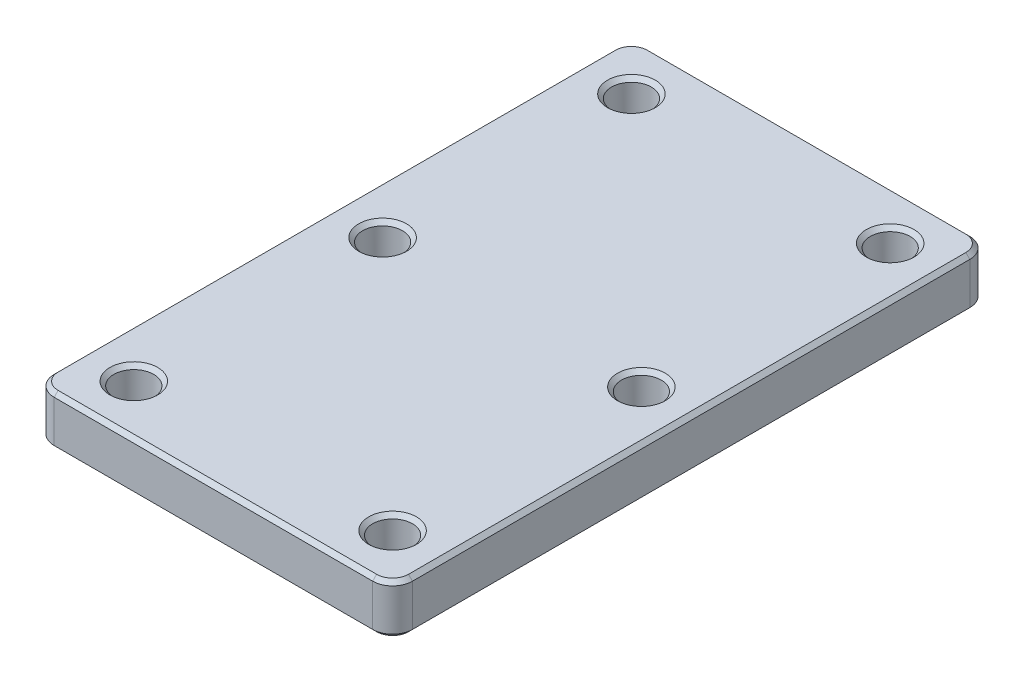
ISO-10303-21;
HEADER;
FILE_DESCRIPTION(('STEP AP214'),'2;1');
FILE_NAME('part.step','',(''),(''),'','','');
FILE_SCHEMA(('AUTOMOTIVE_DESIGN { 1 0 10303 214 1 1 1 1 }'));
ENDSEC;
DATA;
#1=APPLICATION_CONTEXT('core data for automotive mechanical design processes');
#2=APPLICATION_PROTOCOL_DEFINITION('international standard','automotive_design',2000,#1);
#3=PRODUCT_CONTEXT('',#1,'mechanical');
#4=PRODUCT('Part','Part','',(#3));
#5=PRODUCT_RELATED_PRODUCT_CATEGORY('part','',(#4));
#6=PRODUCT_DEFINITION_FORMATION('','',#4);
#7=PRODUCT_DEFINITION_CONTEXT('part definition',#1,'design');
#8=PRODUCT_DEFINITION('design','',#6,#7);
#9=PRODUCT_DEFINITION_SHAPE('','',#8);
#10=(LENGTH_UNIT() NAMED_UNIT(*) SI_UNIT(.MILLI.,.METRE.));
#11=(NAMED_UNIT(*) PLANE_ANGLE_UNIT() SI_UNIT($,.RADIAN.));
#12=(NAMED_UNIT(*) SI_UNIT($,.STERADIAN.) SOLID_ANGLE_UNIT());
#13=UNCERTAINTY_MEASURE_WITH_UNIT(LENGTH_MEASURE(1.E-05),#10,'distance_accuracy_value','');
#14=(GEOMETRIC_REPRESENTATION_CONTEXT(3) GLOBAL_UNCERTAINTY_ASSIGNED_CONTEXT((#13)) GLOBAL_UNIT_ASSIGNED_CONTEXT((#10,
#11,#12)) REPRESENTATION_CONTEXT('',''));
#15=CARTESIAN_POINT('',(0.,0.,0.));
#16=DIRECTION('',(0.,0.,1.));
#17=DIRECTION('',(1.,0.,0.));
#18=AXIS2_PLACEMENT_3D('',#15,#16,#17);
#19=CARTESIAN_POINT('',(0.,25.,0.));
#20=DIRECTION('',(0.,-1.,0.));
#21=DIRECTION('',(0.,0.,-1.));
#22=AXIS2_PLACEMENT_3D('',#19,#20,#21);
#23=PLANE('',#22);
#24=CARTESIAN_POINT('',(24.9999999999999,25.,-25.));
#25=DIRECTION('',(0.,-1.,0.));
#26=DIRECTION('',(0.,0.,-1.));
#27=AXIS2_PLACEMENT_3D('',#24,#25,#26);
#28=CIRCLE('',#27,12.);
#29=CARTESIAN_POINT('',(24.9999999999999,25.,-37.0000000000001));
#30=VERTEX_POINT('',#29);
#31=EDGE_CURVE('E364',#30,#30,#28,.T.);
#32=ORIENTED_EDGE('',*,*,#31,.T.);
#33=EDGE_LOOP('',(#32));
#34=FACE_BOUND('',#33,.T.);
#35=CARTESIAN_POINT('',(25.,25.,-150.));
#36=DIRECTION('',(0.,-1.,0.));
#37=DIRECTION('',(0.,0.,-1.));
#38=AXIS2_PLACEMENT_3D('',#35,#36,#37);
#39=CIRCLE('',#38,12.);
#40=CARTESIAN_POINT('',(25.,25.,-162.));
#41=VERTEX_POINT('',#40);
#42=EDGE_CURVE('E360',#41,#41,#39,.T.);
#43=ORIENTED_EDGE('',*,*,#42,.T.);
#44=EDGE_LOOP('',(#43));
#45=FACE_BOUND('',#44,.T.);
#46=CARTESIAN_POINT('',(25.,25.,-275.));
#47=DIRECTION('',(0.,-1.,0.));
#48=DIRECTION('',(0.,0.,-1.));
#49=AXIS2_PLACEMENT_3D('',#46,#47,#48);
#50=CIRCLE('',#49,12.0000000000001);
#51=CARTESIAN_POINT('',(25.,25.,-287.));
#52=VERTEX_POINT('',#51);
#53=EDGE_CURVE('E356',#52,#52,#50,.T.);
#54=ORIENTED_EDGE('',*,*,#53,.T.);
#55=EDGE_LOOP('',(#54));
#56=FACE_BOUND('',#55,.T.);
#57=CARTESIAN_POINT('',(155.,25.,-275.));
#58=DIRECTION('',(0.,-1.,0.));
#59=DIRECTION('',(0.,0.,-1.));
#60=AXIS2_PLACEMENT_3D('',#57,#58,#59);
#61=CIRCLE('',#60,12.);
#62=CARTESIAN_POINT('',(155.,25.,-287.));
#63=VERTEX_POINT('',#62);
#64=EDGE_CURVE('E352',#63,#63,#61,.T.);
#65=ORIENTED_EDGE('',*,*,#64,.T.);
#66=EDGE_LOOP('',(#65));
#67=FACE_BOUND('',#66,.T.);
#68=CARTESIAN_POINT('',(155.,25.,-150.));
#69=DIRECTION('',(0.,-1.,0.));
#70=DIRECTION('',(0.,0.,-1.));
#71=AXIS2_PLACEMENT_3D('',#68,#69,#70);
#72=CIRCLE('',#71,12.);
#73=CARTESIAN_POINT('',(155.,25.,-162.));
#74=VERTEX_POINT('',#73);
#75=EDGE_CURVE('E348',#74,#74,#72,.T.);
#76=ORIENTED_EDGE('',*,*,#75,.T.);
#77=EDGE_LOOP('',(#76));
#78=FACE_BOUND('',#77,.T.);
#79=CARTESIAN_POINT('',(155.,25.,-25.));
#80=DIRECTION('',(0.,-1.,0.));
#81=DIRECTION('',(0.,0.,-1.));
#82=AXIS2_PLACEMENT_3D('',#79,#80,#81);
#83=CIRCLE('',#82,12.);
#84=CARTESIAN_POINT('',(155.,25.,-37.));
#85=VERTEX_POINT('',#84);
#86=EDGE_CURVE('E290',#85,#85,#83,.T.);
#87=ORIENTED_EDGE('',*,*,#86,.T.);
#88=EDGE_LOOP('',(#87));
#89=FACE_BOUND('',#88,.T.);
#90=CARTESIAN_POINT('',(10.,25.,-10.));
#91=DIRECTION('',(0.,-1.,0.));
#92=DIRECTION('',(0.,0.,-1.));
#93=AXIS2_PLACEMENT_3D('',#90,#91,#92);
#94=CIRCLE('',#93,8.00000000000005);
#95=CARTESIAN_POINT('',(1.99999999999995,25.,-10.));
#96=VERTEX_POINT('',#95);
#97=CARTESIAN_POINT('',(10.,25.,-1.99999999999995));
#98=VERTEX_POINT('',#97);
#99=EDGE_CURVE('E70',#96,#98,#94,.F.);
#100=ORIENTED_EDGE('',*,*,#99,.T.);
#101=DIRECTION('',(1.,0.,0.));
#102=VECTOR('',#101,1.);
#103=CARTESIAN_POINT('',(0.,25.,-1.99999999999994));
#104=LINE('',#103,#102);
#105=CARTESIAN_POINT('',(170.,25.,-1.99999999999994));
#106=VERTEX_POINT('',#105);
#107=EDGE_CURVE('E165',#98,#106,#104,.T.);
#108=ORIENTED_EDGE('',*,*,#107,.T.);
#109=CARTESIAN_POINT('',(170.,25.,-10.));
#110=DIRECTION('',(0.,-1.,0.));
#111=DIRECTION('',(0.,0.,-1.));
#112=AXIS2_PLACEMENT_3D('',#109,#110,#111);
#113=CIRCLE('',#112,8.00000000000006);
#114=CARTESIAN_POINT('',(178.,25.,-10.));
#115=VERTEX_POINT('',#114);
#116=EDGE_CURVE('E285',#106,#115,#113,.F.);
#117=ORIENTED_EDGE('',*,*,#116,.T.);
#118=DIRECTION('',(0.,0.,-1.));
#119=VECTOR('',#118,1.);
#120=CARTESIAN_POINT('',(178.,25.,0.));
#121=LINE('',#120,#119);
#122=CARTESIAN_POINT('',(178.,25.,-290.));
#123=VERTEX_POINT('',#122);
#124=EDGE_CURVE('E280',#115,#123,#121,.T.);
#125=ORIENTED_EDGE('',*,*,#124,.T.);
#126=CARTESIAN_POINT('',(170.,25.,-290.));
#127=DIRECTION('',(0.,-1.,0.));
#128=DIRECTION('',(0.,0.,-1.));
#129=AXIS2_PLACEMENT_3D('',#126,#127,#128);
#130=CIRCLE('',#129,8.00000000000006);
#131=CARTESIAN_POINT('',(170.,25.,-298.));
#132=VERTEX_POINT('',#131);
#133=EDGE_CURVE('E274',#123,#132,#130,.F.);
#134=ORIENTED_EDGE('',*,*,#133,.T.);
#135=DIRECTION('',(-1.,0.,0.));
#136=VECTOR('',#135,1.);
#137=CARTESIAN_POINT('',(0.,25.,-298.));
#138=LINE('',#137,#136);
#139=CARTESIAN_POINT('',(10.,25.,-298.));
#140=VERTEX_POINT('',#139);
#141=EDGE_CURVE('E268',#132,#140,#138,.T.);
#142=ORIENTED_EDGE('',*,*,#141,.T.);
#143=CARTESIAN_POINT('',(10.,25.,-290.));
#144=DIRECTION('',(0.,-1.,0.));
#145=DIRECTION('',(0.,0.,-1.));
#146=AXIS2_PLACEMENT_3D('',#143,#144,#145);
#147=CIRCLE('',#146,8.00000000000005);
#148=CARTESIAN_POINT('',(1.99999999999995,25.,-290.));
#149=VERTEX_POINT('',#148);
#150=EDGE_CURVE('E271',#140,#149,#147,.F.);
#151=ORIENTED_EDGE('',*,*,#150,.T.);
#152=DIRECTION('',(0.,0.,1.));
#153=VECTOR('',#152,1.);
#154=CARTESIAN_POINT('',(1.99999999999995,25.,0.));
#155=LINE('',#154,#153);
#156=EDGE_CURVE('E277',#149,#96,#155,.T.);
#157=ORIENTED_EDGE('',*,*,#156,.T.);
#158=EDGE_LOOP('',(#100,#108,#117,#125,#134,#142,#151,#157));
#159=FACE_BOUND('',#158,.T.);
#160=ADVANCED_FACE('F45',(#34,#45,#56,#67,#78,#89,#159),#23,.F.);
#161=CARTESIAN_POINT('',(0.,0.,0.));
#162=DIRECTION('',(0.,-1.,0.));
#163=DIRECTION('',(0.,0.,-1.));
#164=AXIS2_PLACEMENT_3D('',#161,#162,#163);
#165=PLANE('',#164);
#166=CARTESIAN_POINT('',(170.,0.,-10.));
#167=DIRECTION('',(0.,-1.,0.));
#168=DIRECTION('',(0.,0.,-1.));
#169=AXIS2_PLACEMENT_3D('',#166,#167,#168);
#170=CIRCLE('',#169,8.00000000000006);
#171=CARTESIAN_POINT('',(178.,0.,-10.));
#172=VERTEX_POINT('',#171);
#173=CARTESIAN_POINT('',(170.,0.,-1.99999999999994));
#174=VERTEX_POINT('',#173);
#175=EDGE_CURVE('E224',#172,#174,#170,.T.);
#176=ORIENTED_EDGE('',*,*,#175,.T.);
#177=DIRECTION('',(-1.,0.,0.));
#178=VECTOR('',#177,1.);
#179=CARTESIAN_POINT('',(10.,0.,-1.99999999999994));
#180=LINE('',#179,#178);
#181=CARTESIAN_POINT('',(10.,0.,-1.99999999999994));
#182=VERTEX_POINT('',#181);
#183=EDGE_CURVE('E227',#174,#182,#180,.T.);
#184=ORIENTED_EDGE('',*,*,#183,.T.);
#185=CARTESIAN_POINT('',(10.,0.,-10.));
#186=DIRECTION('',(0.,-1.,0.));
#187=DIRECTION('',(0.,0.,-1.));
#188=AXIS2_PLACEMENT_3D('',#185,#186,#187);
#189=CIRCLE('',#188,8.00000000000005);
#190=CARTESIAN_POINT('',(1.99999999999995,0.,-10.));
#191=VERTEX_POINT('',#190);
#192=EDGE_CURVE('E221',#182,#191,#189,.T.);
#193=ORIENTED_EDGE('',*,*,#192,.T.);
#194=DIRECTION('',(0.,0.,-1.));
#195=VECTOR('',#194,1.);
#196=CARTESIAN_POINT('',(1.99999999999995,0.,-290.));
#197=LINE('',#196,#195);
#198=CARTESIAN_POINT('',(1.99999999999994,0.,-290.));
#199=VERTEX_POINT('',#198);
#200=EDGE_CURVE('E215',#191,#199,#197,.T.);
#201=ORIENTED_EDGE('',*,*,#200,.T.);
#202=CARTESIAN_POINT('',(10.,0.,-290.));
#203=DIRECTION('',(0.,-1.,0.));
#204=DIRECTION('',(0.,0.,-1.));
#205=AXIS2_PLACEMENT_3D('',#202,#203,#204);
#206=CIRCLE('',#205,8.00000000000006);
#207=CARTESIAN_POINT('',(10.,0.,-298.));
#208=VERTEX_POINT('',#207);
#209=EDGE_CURVE('E209',#199,#208,#206,.T.);
#210=ORIENTED_EDGE('',*,*,#209,.T.);
#211=DIRECTION('',(1.,0.,0.));
#212=VECTOR('',#211,1.);
#213=CARTESIAN_POINT('',(170.,0.,-298.));
#214=LINE('',#213,#212);
#215=CARTESIAN_POINT('',(170.,0.,-298.));
#216=VERTEX_POINT('',#215);
#217=EDGE_CURVE('E206',#208,#216,#214,.T.);
#218=ORIENTED_EDGE('',*,*,#217,.T.);
#219=CARTESIAN_POINT('',(170.,0.,-290.));
#220=DIRECTION('',(0.,-1.,0.));
#221=DIRECTION('',(0.,0.,-1.));
#222=AXIS2_PLACEMENT_3D('',#219,#220,#221);
#223=CIRCLE('',#222,8.00000000000006);
#224=CARTESIAN_POINT('',(178.,0.,-290.));
#225=VERTEX_POINT('',#224);
#226=EDGE_CURVE('E212',#216,#225,#223,.T.);
#227=ORIENTED_EDGE('',*,*,#226,.T.);
#228=DIRECTION('',(0.,0.,1.));
#229=VECTOR('',#228,1.);
#230=CARTESIAN_POINT('',(178.,0.,-10.));
#231=LINE('',#230,#229);
#232=EDGE_CURVE('E218',#225,#172,#231,.T.);
#233=ORIENTED_EDGE('',*,*,#232,.T.);
#234=EDGE_LOOP('',(#176,#184,#193,#201,#210,#218,#227,#233));
#235=FACE_BOUND('',#234,.T.);
#236=CARTESIAN_POINT('',(25.,0.,-150.));
#237=DIRECTION('',(0.,1.,0.));
#238=DIRECTION('',(0.,0.,1.));
#239=AXIS2_PLACEMENT_3D('',#236,#237,#238);
#240=CIRCLE('',#239,10.);
#241=CARTESIAN_POINT('',(25.,0.,-140.));
#242=VERTEX_POINT('',#241);
#243=EDGE_CURVE('E596',#242,#242,#240,.F.);
#244=ORIENTED_EDGE('',*,*,#243,.F.);
#245=EDGE_LOOP('',(#244));
#246=FACE_BOUND('',#245,.T.);
#247=CARTESIAN_POINT('',(155.,0.,-275.));
#248=DIRECTION('',(0.,1.,0.));
#249=DIRECTION('',(0.,0.,1.));
#250=AXIS2_PLACEMENT_3D('',#247,#248,#249);
#251=CIRCLE('',#250,10.);
#252=CARTESIAN_POINT('',(155.,0.,-265.));
#253=VERTEX_POINT('',#252);
#254=EDGE_CURVE('E600',#253,#253,#251,.F.);
#255=ORIENTED_EDGE('',*,*,#254,.F.);
#256=EDGE_LOOP('',(#255));
#257=FACE_BOUND('',#256,.T.);
#258=CARTESIAN_POINT('',(24.9999999999999,0.,-25.));
#259=DIRECTION('',(0.,1.,0.));
#260=DIRECTION('',(0.,0.,1.));
#261=AXIS2_PLACEMENT_3D('',#258,#259,#260);
#262=CIRCLE('',#261,10.);
#263=CARTESIAN_POINT('',(24.9999999999999,0.,-15.));
#264=VERTEX_POINT('',#263);
#265=EDGE_CURVE('E611',#264,#264,#262,.F.);
#266=ORIENTED_EDGE('',*,*,#265,.F.);
#267=EDGE_LOOP('',(#266));
#268=FACE_BOUND('',#267,.T.);
#269=CARTESIAN_POINT('',(25.,0.,-275.));
#270=DIRECTION('',(0.,1.,0.));
#271=DIRECTION('',(0.,0.,1.));
#272=AXIS2_PLACEMENT_3D('',#269,#270,#271);
#273=CIRCLE('',#272,10.);
#274=CARTESIAN_POINT('',(25.,0.,-265.));
#275=VERTEX_POINT('',#274);
#276=EDGE_CURVE('E322',#275,#275,#273,.T.);
#277=ORIENTED_EDGE('',*,*,#276,.T.);
#278=EDGE_LOOP('',(#277));
#279=FACE_BOUND('',#278,.T.);
#280=CARTESIAN_POINT('',(155.,0.,-25.));
#281=DIRECTION('',(0.,1.,0.));
#282=DIRECTION('',(0.,0.,1.));
#283=AXIS2_PLACEMENT_3D('',#280,#281,#282);
#284=CIRCLE('',#283,10.);
#285=CARTESIAN_POINT('',(155.,0.,-15.));
#286=VERTEX_POINT('',#285);
#287=EDGE_CURVE('E607',#286,#286,#284,.T.);
#288=ORIENTED_EDGE('',*,*,#287,.T.);
#289=EDGE_LOOP('',(#288));
#290=FACE_BOUND('',#289,.T.);
#291=CARTESIAN_POINT('',(155.,0.,-150.));
#292=DIRECTION('',(0.,1.,0.));
#293=DIRECTION('',(0.,0.,1.));
#294=AXIS2_PLACEMENT_3D('',#291,#292,#293);
#295=CIRCLE('',#294,10.);
#296=CARTESIAN_POINT('',(155.,0.,-140.));
#297=VERTEX_POINT('',#296);
#298=EDGE_CURVE('E605',#297,#297,#295,.T.);
#299=ORIENTED_EDGE('',*,*,#298,.T.);
#300=EDGE_LOOP('',(#299));
#301=FACE_BOUND('',#300,.T.);
#302=ADVANCED_FACE('F405',(#235,#246,#257,#268,#279,#290,#301),#165,.T.);
#303=CARTESIAN_POINT('',(0.,25.,0.));
#304=DIRECTION('',(1.,0.,0.));
#305=DIRECTION('',(0.,0.,-1.));
#306=AXIS2_PLACEMENT_3D('',#303,#304,#305);
#307=PLANE('',#306);
#308=DIRECTION('',(0.,-1.,0.));
#309=VECTOR('',#308,1.);
#310=CARTESIAN_POINT('',(0.,25.,-290.));
#311=LINE('',#310,#309);
#312=CARTESIAN_POINT('',(0.,23.0000000000001,-290.));
#313=VERTEX_POINT('',#312);
#314=CARTESIAN_POINT('',(0.,1.99999999999995,-290.));
#315=VERTEX_POINT('',#314);
#316=EDGE_CURVE('E200',#313,#315,#311,.T.);
#317=ORIENTED_EDGE('',*,*,#316,.T.);
#318=DIRECTION('',(0.,0.,1.));
#319=VECTOR('',#318,1.);
#320=CARTESIAN_POINT('',(0.,1.99999999999995,-10.));
#321=LINE('',#320,#319);
#322=CARTESIAN_POINT('',(0.,1.99999999999995,-10.));
#323=VERTEX_POINT('',#322);
#324=EDGE_CURVE('E247',#315,#323,#321,.T.);
#325=ORIENTED_EDGE('',*,*,#324,.T.);
#326=DIRECTION('',(0.,-1.,0.));
#327=VECTOR('',#326,1.);
#328=CARTESIAN_POINT('',(0.,25.,-10.));
#329=LINE('',#328,#327);
#330=CARTESIAN_POINT('',(0.,23.0000000000001,-10.));
#331=VERTEX_POINT('',#330);
#332=EDGE_CURVE('E634',#323,#331,#329,.F.);
#333=ORIENTED_EDGE('',*,*,#332,.T.);
#334=DIRECTION('',(0.,0.,-1.));
#335=VECTOR('',#334,1.);
#336=CARTESIAN_POINT('',(0.,23.0000000000001,0.));
#337=LINE('',#336,#335);
#338=EDGE_CURVE('E244',#331,#313,#337,.T.);
#339=ORIENTED_EDGE('',*,*,#338,.T.);
#340=EDGE_LOOP('',(#317,#325,#333,#339));
#341=FACE_BOUND('',#340,.T.);
#342=ADVANCED_FACE('F411',(#341),#307,.F.);
#343=CARTESIAN_POINT('',(0.,25.,0.));
#344=DIRECTION('',(0.,0.,-1.));
#345=DIRECTION('',(-1.,0.,0.));
#346=AXIS2_PLACEMENT_3D('',#343,#344,#345);
#347=PLANE('',#346);
#348=DIRECTION('',(0.,-1.,0.));
#349=VECTOR('',#348,1.);
#350=CARTESIAN_POINT('',(10.,25.,0.));
#351=LINE('',#350,#349);
#352=CARTESIAN_POINT('',(10.,23.0000000000001,0.));
#353=VERTEX_POINT('',#352);
#354=CARTESIAN_POINT('',(10.,1.99999999999995,0.));
#355=VERTEX_POINT('',#354);
#356=EDGE_CURVE('E188',#353,#355,#351,.T.);
#357=ORIENTED_EDGE('',*,*,#356,.T.);
#358=DIRECTION('',(1.,0.,0.));
#359=VECTOR('',#358,1.);
#360=CARTESIAN_POINT('',(170.,1.99999999999995,0.));
#361=LINE('',#360,#359);
#362=CARTESIAN_POINT('',(170.,1.99999999999995,0.));
#363=VERTEX_POINT('',#362);
#364=EDGE_CURVE('E193',#355,#363,#361,.T.);
#365=ORIENTED_EDGE('',*,*,#364,.T.);
#366=DIRECTION('',(0.,-1.,0.));
#367=VECTOR('',#366,1.);
#368=CARTESIAN_POINT('',(170.,25.,0.));
#369=LINE('',#368,#367);
#370=CARTESIAN_POINT('',(170.,23.0000000000001,0.));
#371=VERTEX_POINT('',#370);
#372=EDGE_CURVE('E191',#363,#371,#369,.F.);
#373=ORIENTED_EDGE('',*,*,#372,.T.);
#374=DIRECTION('',(-1.,0.,0.));
#375=VECTOR('',#374,1.);
#376=CARTESIAN_POINT('',(0.,23.0000000000001,0.));
#377=LINE('',#376,#375);
#378=EDGE_CURVE('E164',#371,#353,#377,.T.);
#379=ORIENTED_EDGE('',*,*,#378,.T.);
#380=EDGE_LOOP('',(#357,#365,#373,#379));
#381=FACE_BOUND('',#380,.T.);
#382=ADVANCED_FACE('F186',(#381),#347,.F.);
#383=CARTESIAN_POINT('',(180.,25.,0.));
#384=DIRECTION('',(-1.,0.,0.));
#385=DIRECTION('',(0.,0.,1.));
#386=AXIS2_PLACEMENT_3D('',#383,#384,#385);
#387=PLANE('',#386);
#388=DIRECTION('',(0.,-1.,0.));
#389=VECTOR('',#388,1.);
#390=CARTESIAN_POINT('',(180.,25.,-10.));
#391=LINE('',#390,#389);
#392=CARTESIAN_POINT('',(180.,23.0000000000001,-10.));
#393=VERTEX_POINT('',#392);
#394=CARTESIAN_POINT('',(180.,1.99999999999995,-10.));
#395=VERTEX_POINT('',#394);
#396=EDGE_CURVE('E626',#393,#395,#391,.T.);
#397=ORIENTED_EDGE('',*,*,#396,.T.);
#398=DIRECTION('',(0.,0.,-1.));
#399=VECTOR('',#398,1.);
#400=CARTESIAN_POINT('',(180.,1.99999999999995,-290.));
#401=LINE('',#400,#399);
#402=CARTESIAN_POINT('',(180.,1.99999999999995,-290.));
#403=VERTEX_POINT('',#402);
#404=EDGE_CURVE('E241',#395,#403,#401,.T.);
#405=ORIENTED_EDGE('',*,*,#404,.T.);
#406=DIRECTION('',(0.,-1.,0.));
#407=VECTOR('',#406,1.);
#408=CARTESIAN_POINT('',(180.,25.,-290.));
#409=LINE('',#408,#407);
#410=CARTESIAN_POINT('',(180.,23.0000000000001,-290.));
#411=VERTEX_POINT('',#410);
#412=EDGE_CURVE('E630',#403,#411,#409,.F.);
#413=ORIENTED_EDGE('',*,*,#412,.T.);
#414=DIRECTION('',(0.,0.,1.));
#415=VECTOR('',#414,1.);
#416=CARTESIAN_POINT('',(180.,23.0000000000001,0.));
#417=LINE('',#416,#415);
#418=EDGE_CURVE('E238',#411,#393,#417,.T.);
#419=ORIENTED_EDGE('',*,*,#418,.T.);
#420=EDGE_LOOP('',(#397,#405,#413,#419));
#421=FACE_BOUND('',#420,.T.);
#422=ADVANCED_FACE('F422',(#421),#387,.F.);
#423=CARTESIAN_POINT('',(0.,25.,-300.));
#424=DIRECTION('',(0.,0.,1.));
#425=DIRECTION('',(1.,0.,0.));
#426=AXIS2_PLACEMENT_3D('',#423,#424,#425);
#427=PLANE('',#426);
#428=DIRECTION('',(0.,-1.,0.));
#429=VECTOR('',#428,1.);
#430=CARTESIAN_POINT('',(170.,25.,-300.));
#431=LINE('',#430,#429);
#432=CARTESIAN_POINT('',(170.,23.0000000000001,-300.));
#433=VERTEX_POINT('',#432);
#434=CARTESIAN_POINT('',(170.,1.99999999999995,-300.));
#435=VERTEX_POINT('',#434);
#436=EDGE_CURVE('E622',#433,#435,#431,.T.);
#437=ORIENTED_EDGE('',*,*,#436,.T.);
#438=DIRECTION('',(-1.,0.,0.));
#439=VECTOR('',#438,1.);
#440=CARTESIAN_POINT('',(10.,1.99999999999995,-300.));
#441=LINE('',#440,#439);
#442=CARTESIAN_POINT('',(10.,1.99999999999995,-300.));
#443=VERTEX_POINT('',#442);
#444=EDGE_CURVE('E265',#435,#443,#441,.T.);
#445=ORIENTED_EDGE('',*,*,#444,.T.);
#446=DIRECTION('',(0.,-1.,0.));
#447=VECTOR('',#446,1.);
#448=CARTESIAN_POINT('',(10.,25.,-300.));
#449=LINE('',#448,#447);
#450=CARTESIAN_POINT('',(10.,23.0000000000001,-300.));
#451=VERTEX_POINT('',#450);
#452=EDGE_CURVE('E618',#443,#451,#449,.F.);
#453=ORIENTED_EDGE('',*,*,#452,.T.);
#454=DIRECTION('',(1.,0.,0.));
#455=VECTOR('',#454,1.);
#456=CARTESIAN_POINT('',(0.,23.0000000000001,-300.));
#457=LINE('',#456,#455);
#458=EDGE_CURVE('E262',#451,#433,#457,.T.);
#459=ORIENTED_EDGE('',*,*,#458,.T.);
#460=EDGE_LOOP('',(#437,#445,#453,#459));
#461=FACE_BOUND('',#460,.T.);
#462=ADVANCED_FACE('F419',(#461),#427,.F.);
#463=CARTESIAN_POINT('',(24.9999999999999,0.,-25.));
#464=DIRECTION('',(0.,1.,0.));
#465=DIRECTION('',(0.,0.,1.));
#466=AXIS2_PLACEMENT_3D('',#463,#464,#465);
#467=CYLINDRICAL_SURFACE('',#466,10.);
#468=CARTESIAN_POINT('',(24.9999999999999,23.,-25.));
#469=DIRECTION('',(0.,-1.,0.));
#470=DIRECTION('',(0.,0.,-1.));
#471=AXIS2_PLACEMENT_3D('',#468,#469,#470);
#472=CIRCLE('',#471,10.);
#473=CARTESIAN_POINT('',(24.9999999999999,23.,-35.));
#474=VERTEX_POINT('',#473);
#475=EDGE_CURVE('E368',#474,#474,#472,.F.);
#476=ORIENTED_EDGE('',*,*,#475,.T.);
#477=EDGE_LOOP('',(#476));
#478=FACE_BOUND('',#477,.T.);
#479=ORIENTED_EDGE('',*,*,#265,.T.);
#480=EDGE_LOOP('',(#479));
#481=FACE_BOUND('',#480,.T.);
#482=ADVANCED_FACE('F416',(#478,#481),#467,.F.);
#483=CARTESIAN_POINT('',(25.,0.,-275.));
#484=DIRECTION('',(0.,1.,0.));
#485=DIRECTION('',(0.,0.,1.));
#486=AXIS2_PLACEMENT_3D('',#483,#484,#485);
#487=CYLINDRICAL_SURFACE('',#486,10.);
#488=CARTESIAN_POINT('',(25.,23.,-275.));
#489=DIRECTION('',(0.,-1.,0.));
#490=DIRECTION('',(0.,0.,-1.));
#491=AXIS2_PLACEMENT_3D('',#488,#489,#490);
#492=CIRCLE('',#491,10.);
#493=CARTESIAN_POINT('',(25.,23.,-285.));
#494=VERTEX_POINT('',#493);
#495=EDGE_CURVE('E376',#494,#494,#492,.F.);
#496=ORIENTED_EDGE('',*,*,#495,.T.);
#497=EDGE_LOOP('',(#496));
#498=FACE_BOUND('',#497,.T.);
#499=ORIENTED_EDGE('',*,*,#276,.F.);
#500=EDGE_LOOP('',(#499));
#501=FACE_BOUND('',#500,.T.);
#502=ADVANCED_FACE('F587',(#498,#501),#487,.F.);
#503=CARTESIAN_POINT('',(155.,0.,-25.));
#504=DIRECTION('',(0.,1.,0.));
#505=DIRECTION('',(0.,0.,1.));
#506=AXIS2_PLACEMENT_3D('',#503,#504,#505);
#507=CYLINDRICAL_SURFACE('',#506,10.);
#508=CARTESIAN_POINT('',(155.,23.,-25.));
#509=DIRECTION('',(0.,-1.,0.));
#510=DIRECTION('',(0.,0.,-1.));
#511=AXIS2_PLACEMENT_3D('',#508,#509,#510);
#512=CIRCLE('',#511,10.);
#513=CARTESIAN_POINT('',(155.,23.,-35.));
#514=VERTEX_POINT('',#513);
#515=EDGE_CURVE('E11',#514,#514,#512,.F.);
#516=ORIENTED_EDGE('',*,*,#515,.T.);
#517=EDGE_LOOP('',(#516));
#518=FACE_BOUND('',#517,.T.);
#519=ORIENTED_EDGE('',*,*,#287,.F.);
#520=EDGE_LOOP('',(#519));
#521=FACE_BOUND('',#520,.T.);
#522=ADVANCED_FACE('F590',(#518,#521),#507,.F.);
#523=CARTESIAN_POINT('',(155.,0.,-150.));
#524=DIRECTION('',(0.,1.,0.));
#525=DIRECTION('',(0.,0.,1.));
#526=AXIS2_PLACEMENT_3D('',#523,#524,#525);
#527=CYLINDRICAL_SURFACE('',#526,10.);
#528=CARTESIAN_POINT('',(155.,23.,-150.));
#529=DIRECTION('',(0.,-1.,0.));
#530=DIRECTION('',(0.,0.,-1.));
#531=AXIS2_PLACEMENT_3D('',#528,#529,#530);
#532=CIRCLE('',#531,10.);
#533=CARTESIAN_POINT('',(155.,23.,-160.));
#534=VERTEX_POINT('',#533);
#535=EDGE_CURVE('E55',#534,#534,#532,.F.);
#536=ORIENTED_EDGE('',*,*,#535,.T.);
#537=EDGE_LOOP('',(#536));
#538=FACE_BOUND('',#537,.T.);
#539=ORIENTED_EDGE('',*,*,#298,.F.);
#540=EDGE_LOOP('',(#539));
#541=FACE_BOUND('',#540,.T.);
#542=ADVANCED_FACE('F387',(#538,#541),#527,.F.);
#543=CARTESIAN_POINT('',(155.,0.,-275.));
#544=DIRECTION('',(0.,1.,0.));
#545=DIRECTION('',(0.,0.,1.));
#546=AXIS2_PLACEMENT_3D('',#543,#544,#545);
#547=CYLINDRICAL_SURFACE('',#546,10.);
#548=CARTESIAN_POINT('',(155.,23.,-275.));
#549=DIRECTION('',(0.,-1.,0.));
#550=DIRECTION('',(0.,0.,-1.));
#551=AXIS2_PLACEMENT_3D('',#548,#549,#550);
#552=CIRCLE('',#551,10.);
#553=CARTESIAN_POINT('',(155.,23.,-285.));
#554=VERTEX_POINT('',#553);
#555=EDGE_CURVE('E380',#554,#554,#552,.F.);
#556=ORIENTED_EDGE('',*,*,#555,.T.);
#557=EDGE_LOOP('',(#556));
#558=FACE_BOUND('',#557,.T.);
#559=ORIENTED_EDGE('',*,*,#254,.T.);
#560=EDGE_LOOP('',(#559));
#561=FACE_BOUND('',#560,.T.);
#562=ADVANCED_FACE('F692',(#558,#561),#547,.F.);
#563=CARTESIAN_POINT('',(25.,0.,-150.));
#564=DIRECTION('',(0.,1.,0.));
#565=DIRECTION('',(0.,0.,1.));
#566=AXIS2_PLACEMENT_3D('',#563,#564,#565);
#567=CYLINDRICAL_SURFACE('',#566,10.);
#568=CARTESIAN_POINT('',(25.,23.,-150.));
#569=DIRECTION('',(0.,-1.,0.));
#570=DIRECTION('',(0.,0.,-1.));
#571=AXIS2_PLACEMENT_3D('',#568,#569,#570);
#572=CIRCLE('',#571,10.);
#573=CARTESIAN_POINT('',(25.,23.,-160.));
#574=VERTEX_POINT('',#573);
#575=EDGE_CURVE('E372',#574,#574,#572,.F.);
#576=ORIENTED_EDGE('',*,*,#575,.T.);
#577=EDGE_LOOP('',(#576));
#578=FACE_BOUND('',#577,.T.);
#579=ORIENTED_EDGE('',*,*,#243,.T.);
#580=EDGE_LOOP('',(#579));
#581=FACE_BOUND('',#580,.T.);
#582=ADVANCED_FACE('F436',(#578,#581),#567,.F.);
#583=CARTESIAN_POINT('',(170.,25.,-290.));
#584=DIRECTION('',(0.,-1.,0.));
#585=DIRECTION('',(0.,0.,-1.));
#586=AXIS2_PLACEMENT_3D('',#583,#584,#585);
#587=CYLINDRICAL_SURFACE('',#586,10.);
#588=ORIENTED_EDGE('',*,*,#412,.F.);
#589=CARTESIAN_POINT('',(170.,1.99999999999995,-290.));
#590=DIRECTION('',(0.,-1.,0.));
#591=DIRECTION('',(0.,0.,-1.));
#592=AXIS2_PLACEMENT_3D('',#589,#590,#591);
#593=CIRCLE('',#592,10.);
#594=EDGE_CURVE('E253',#403,#435,#593,.F.);
#595=ORIENTED_EDGE('',*,*,#594,.T.);
#596=ORIENTED_EDGE('',*,*,#436,.F.);
#597=CARTESIAN_POINT('',(170.,23.0000000000001,-290.));
#598=DIRECTION('',(0.,-1.,0.));
#599=DIRECTION('',(0.,0.,-1.));
#600=AXIS2_PLACEMENT_3D('',#597,#598,#599);
#601=CIRCLE('',#600,10.);
#602=EDGE_CURVE('E250',#433,#411,#601,.T.);
#603=ORIENTED_EDGE('',*,*,#602,.T.);
#604=EDGE_LOOP('',(#588,#595,#596,#603));
#605=FACE_BOUND('',#604,.T.);
#606=ADVANCED_FACE('F432',(#605),#587,.T.);
#607=CARTESIAN_POINT('',(10.,25.,-290.));
#608=DIRECTION('',(0.,-1.,0.));
#609=DIRECTION('',(0.,0.,-1.));
#610=AXIS2_PLACEMENT_3D('',#607,#608,#609);
#611=CYLINDRICAL_SURFACE('',#610,10.);
#612=ORIENTED_EDGE('',*,*,#452,.F.);
#613=CARTESIAN_POINT('',(10.,1.99999999999995,-290.));
#614=DIRECTION('',(0.,-1.,0.));
#615=DIRECTION('',(0.,0.,-1.));
#616=AXIS2_PLACEMENT_3D('',#613,#614,#615);
#617=CIRCLE('',#616,10.);
#618=EDGE_CURVE('E259',#443,#315,#617,.F.);
#619=ORIENTED_EDGE('',*,*,#618,.T.);
#620=ORIENTED_EDGE('',*,*,#316,.F.);
#621=CARTESIAN_POINT('',(10.,23.0000000000001,-290.));
#622=DIRECTION('',(0.,-1.,0.));
#623=DIRECTION('',(0.,0.,-1.));
#624=AXIS2_PLACEMENT_3D('',#621,#622,#623);
#625=CIRCLE('',#624,10.);
#626=EDGE_CURVE('E256',#313,#451,#625,.T.);
#627=ORIENTED_EDGE('',*,*,#626,.T.);
#628=EDGE_LOOP('',(#612,#619,#620,#627));
#629=FACE_BOUND('',#628,.T.);
#630=ADVANCED_FACE('F435',(#629),#611,.T.);
#631=CARTESIAN_POINT('',(10.,25.,-10.));
#632=DIRECTION('',(0.,-1.,0.));
#633=DIRECTION('',(0.,0.,-1.));
#634=AXIS2_PLACEMENT_3D('',#631,#632,#633);
#635=CYLINDRICAL_SURFACE('',#634,10.);
#636=ORIENTED_EDGE('',*,*,#332,.F.);
#637=CARTESIAN_POINT('',(10.,1.99999999999995,-10.));
#638=DIRECTION('',(0.,-1.,0.));
#639=DIRECTION('',(0.,0.,-1.));
#640=AXIS2_PLACEMENT_3D('',#637,#638,#639);
#641=CIRCLE('',#640,10.);
#642=EDGE_CURVE('E180',#323,#355,#641,.F.);
#643=ORIENTED_EDGE('',*,*,#642,.T.);
#644=ORIENTED_EDGE('',*,*,#356,.F.);
#645=CARTESIAN_POINT('',(10.,23.0000000000001,-10.));
#646=DIRECTION('',(0.,-1.,0.));
#647=DIRECTION('',(0.,0.,-1.));
#648=AXIS2_PLACEMENT_3D('',#645,#646,#647);
#649=CIRCLE('',#648,10.);
#650=EDGE_CURVE('E171',#353,#331,#649,.T.);
#651=ORIENTED_EDGE('',*,*,#650,.T.);
#652=EDGE_LOOP('',(#636,#643,#644,#651));
#653=FACE_BOUND('',#652,.T.);
#654=ADVANCED_FACE('F195',(#653),#635,.T.);
#655=CARTESIAN_POINT('',(170.,25.,-10.));
#656=DIRECTION('',(0.,-1.,0.));
#657=DIRECTION('',(0.,0.,-1.));
#658=AXIS2_PLACEMENT_3D('',#655,#656,#657);
#659=CYLINDRICAL_SURFACE('',#658,10.);
#660=ORIENTED_EDGE('',*,*,#372,.F.);
#661=CARTESIAN_POINT('',(170.,1.99999999999995,-10.));
#662=DIRECTION('',(0.,-1.,0.));
#663=DIRECTION('',(0.,0.,-1.));
#664=AXIS2_PLACEMENT_3D('',#661,#662,#663);
#665=CIRCLE('',#664,10.);
#666=EDGE_CURVE('E181',#363,#395,#665,.F.);
#667=ORIENTED_EDGE('',*,*,#666,.T.);
#668=ORIENTED_EDGE('',*,*,#396,.F.);
#669=CARTESIAN_POINT('',(170.,23.0000000000001,-10.));
#670=DIRECTION('',(0.,-1.,0.));
#671=DIRECTION('',(0.,0.,-1.));
#672=AXIS2_PLACEMENT_3D('',#669,#670,#671);
#673=CIRCLE('',#672,10.);
#674=EDGE_CURVE('E231',#393,#371,#673,.T.);
#675=ORIENTED_EDGE('',*,*,#674,.T.);
#676=EDGE_LOOP('',(#660,#667,#668,#675));
#677=FACE_BOUND('',#676,.T.);
#678=ADVANCED_FACE('F443',(#677),#659,.T.);
#679=CARTESIAN_POINT('',(0.,1.99999999999995,-300.));
#680=DIRECTION('',(0.,-0.707106781186548,-0.707106781186548));
#681=DIRECTION('',(1.,0.,0.));
#682=AXIS2_PLACEMENT_3D('',#679,#680,#681);
#683=PLANE('',#682);
#684=DIRECTION('',(0.,0.707106781186548,-0.707106781186548));
#685=VECTOR('',#684,1.);
#686=CARTESIAN_POINT('',(170.,0.,-298.));
#687=LINE('',#686,#685);
#688=EDGE_CURVE('E314',#216,#435,#687,.T.);
#689=ORIENTED_EDGE('',*,*,#688,.F.);
#690=ORIENTED_EDGE('',*,*,#217,.F.);
#691=DIRECTION('',(0.,-0.707106781186548,0.707106781186548));
#692=VECTOR('',#691,1.);
#693=CARTESIAN_POINT('',(10.,1.99999999999995,-300.));
#694=LINE('',#693,#692);
#695=EDGE_CURVE('E318',#443,#208,#694,.T.);
#696=ORIENTED_EDGE('',*,*,#695,.F.);
#697=ORIENTED_EDGE('',*,*,#444,.F.);
#698=EDGE_LOOP('',(#689,#690,#696,#697));
#699=FACE_BOUND('',#698,.T.);
#700=ADVANCED_FACE('F446',(#699),#683,.T.);
#701=CARTESIAN_POINT('',(10.,0.,-290.));
#702=DIRECTION('',(0.,1.,0.));
#703=DIRECTION('',(0.,0.,1.));
#704=AXIS2_PLACEMENT_3D('',#701,#702,#703);
#705=CONICAL_SURFACE('',#704,8.00000000000005,0.785398163397448);
#706=ORIENTED_EDGE('',*,*,#695,.T.);
#707=ORIENTED_EDGE('',*,*,#209,.F.);
#708=DIRECTION('',(0.707106781186546,-0.707106781186549,0.));
#709=VECTOR('',#708,1.);
#710=CARTESIAN_POINT('',(0.,1.99999999999995,-290.));
#711=LINE('',#710,#709);
#712=EDGE_CURVE('E310',#315,#199,#711,.T.);
#713=ORIENTED_EDGE('',*,*,#712,.F.);
#714=ORIENTED_EDGE('',*,*,#618,.F.);
#715=EDGE_LOOP('',(#706,#707,#713,#714));
#716=FACE_BOUND('',#715,.T.);
#717=ADVANCED_FACE('F492',(#716),#705,.T.);
#718=CARTESIAN_POINT('',(170.,0.,-290.));
#719=DIRECTION('',(0.,1.,0.));
#720=DIRECTION('',(0.,0.,1.));
#721=AXIS2_PLACEMENT_3D('',#718,#719,#720);
#722=CONICAL_SURFACE('',#721,8.00000000000006,0.785398163397446);
#723=ORIENTED_EDGE('',*,*,#688,.T.);
#724=ORIENTED_EDGE('',*,*,#594,.F.);
#725=DIRECTION('',(0.707106781186548,0.707106781186548,0.));
#726=VECTOR('',#725,1.);
#727=CARTESIAN_POINT('',(178.,0.,-290.));
#728=LINE('',#727,#726);
#729=EDGE_CURVE('E306',#225,#403,#728,.T.);
#730=ORIENTED_EDGE('',*,*,#729,.F.);
#731=ORIENTED_EDGE('',*,*,#226,.F.);
#732=EDGE_LOOP('',(#723,#724,#730,#731));
#733=FACE_BOUND('',#732,.T.);
#734=ADVANCED_FACE('F485',(#733),#722,.T.);
#735=CARTESIAN_POINT('',(0.,1.99999999999995,0.));
#736=DIRECTION('',(-0.707106781186548,-0.707106781186548,0.));
#737=DIRECTION('',(0.,0.,-1.));
#738=AXIS2_PLACEMENT_3D('',#735,#736,#737);
#739=PLANE('',#738);
#740=ORIENTED_EDGE('',*,*,#712,.T.);
#741=ORIENTED_EDGE('',*,*,#200,.F.);
#742=DIRECTION('',(0.707106781186548,-0.707106781186548,0.));
#743=VECTOR('',#742,1.);
#744=CARTESIAN_POINT('',(0.,1.99999999999995,-10.));
#745=LINE('',#744,#743);
#746=EDGE_CURVE('E302',#323,#191,#745,.T.);
#747=ORIENTED_EDGE('',*,*,#746,.F.);
#748=ORIENTED_EDGE('',*,*,#324,.F.);
#749=EDGE_LOOP('',(#740,#741,#747,#748));
#750=FACE_BOUND('',#749,.T.);
#751=ADVANCED_FACE('F478',(#750),#739,.T.);
#752=CARTESIAN_POINT('',(180.,1.99999999999995,0.));
#753=DIRECTION('',(0.707106781186548,-0.707106781186548,0.));
#754=DIRECTION('',(0.,0.,1.));
#755=AXIS2_PLACEMENT_3D('',#752,#753,#754);
#756=PLANE('',#755);
#757=ORIENTED_EDGE('',*,*,#729,.T.);
#758=ORIENTED_EDGE('',*,*,#404,.F.);
#759=DIRECTION('',(0.707106781186548,0.707106781186548,0.));
#760=VECTOR('',#759,1.);
#761=CARTESIAN_POINT('',(178.,0.,-10.));
#762=LINE('',#761,#760);
#763=EDGE_CURVE('E298',#172,#395,#762,.T.);
#764=ORIENTED_EDGE('',*,*,#763,.F.);
#765=ORIENTED_EDGE('',*,*,#232,.F.);
#766=EDGE_LOOP('',(#757,#758,#764,#765));
#767=FACE_BOUND('',#766,.T.);
#768=ADVANCED_FACE('F471',(#767),#756,.T.);
#769=CARTESIAN_POINT('',(10.,0.,-10.));
#770=DIRECTION('',(0.,1.,0.));
#771=DIRECTION('',(0.,0.,1.));
#772=AXIS2_PLACEMENT_3D('',#769,#770,#771);
#773=CONICAL_SURFACE('',#772,8.00000000000005,0.785398163397448);
#774=ORIENTED_EDGE('',*,*,#746,.T.);
#775=ORIENTED_EDGE('',*,*,#192,.F.);
#776=DIRECTION('',(0.,-0.707106781186548,-0.707106781186548));
#777=VECTOR('',#776,1.);
#778=CARTESIAN_POINT('',(10.,1.99999999999995,0.));
#779=LINE('',#778,#777);
#780=EDGE_CURVE('E294',#355,#182,#779,.T.);
#781=ORIENTED_EDGE('',*,*,#780,.F.);
#782=ORIENTED_EDGE('',*,*,#642,.F.);
#783=EDGE_LOOP('',(#774,#775,#781,#782));
#784=FACE_BOUND('',#783,.T.);
#785=ADVANCED_FACE('F464',(#784),#773,.T.);
#786=CARTESIAN_POINT('',(170.,0.,-10.));
#787=DIRECTION('',(0.,1.,0.));
#788=DIRECTION('',(0.,0.,1.));
#789=AXIS2_PLACEMENT_3D('',#786,#787,#788);
#790=CONICAL_SURFACE('',#789,8.00000000000006,0.785398163397446);
#791=ORIENTED_EDGE('',*,*,#763,.T.);
#792=ORIENTED_EDGE('',*,*,#666,.F.);
#793=DIRECTION('',(0.,0.707106781186549,0.707106781186546));
#794=VECTOR('',#793,1.);
#795=CARTESIAN_POINT('',(170.,0.,-1.99999999999994));
#796=LINE('',#795,#794);
#797=EDGE_CURVE('E291',#174,#363,#796,.T.);
#798=ORIENTED_EDGE('',*,*,#797,.F.);
#799=ORIENTED_EDGE('',*,*,#175,.F.);
#800=EDGE_LOOP('',(#791,#792,#798,#799));
#801=FACE_BOUND('',#800,.T.);
#802=ADVANCED_FACE('F457',(#801),#790,.T.);
#803=CARTESIAN_POINT('',(0.,1.99999999999995,0.));
#804=DIRECTION('',(0.,-0.707106781186547,0.707106781186548));
#805=DIRECTION('',(-1.,0.,0.));
#806=AXIS2_PLACEMENT_3D('',#803,#804,#805);
#807=PLANE('',#806);
#808=ORIENTED_EDGE('',*,*,#780,.T.);
#809=ORIENTED_EDGE('',*,*,#183,.F.);
#810=ORIENTED_EDGE('',*,*,#797,.T.);
#811=ORIENTED_EDGE('',*,*,#364,.F.);
#812=EDGE_LOOP('',(#808,#809,#810,#811));
#813=FACE_BOUND('',#812,.T.);
#814=ADVANCED_FACE('F449',(#813),#807,.T.);
#815=CARTESIAN_POINT('',(0.,25.,-298.));
#816=DIRECTION('',(0.,-0.707106781186548,0.707106781186548));
#817=DIRECTION('',(-1.,0.,0.));
#818=AXIS2_PLACEMENT_3D('',#815,#816,#817);
#819=PLANE('',#818);
#820=DIRECTION('',(0.,0.707106781186548,0.707106781186548));
#821=VECTOR('',#820,1.);
#822=CARTESIAN_POINT('',(170.,23.0000000000001,-300.));
#823=LINE('',#822,#821);
#824=EDGE_CURVE('E338',#433,#132,#823,.T.);
#825=ORIENTED_EDGE('',*,*,#824,.F.);
#826=ORIENTED_EDGE('',*,*,#458,.F.);
#827=DIRECTION('',(0.,-0.707106781186548,-0.707106781186548));
#828=VECTOR('',#827,1.);
#829=CARTESIAN_POINT('',(10.,25.,-298.));
#830=LINE('',#829,#828);
#831=EDGE_CURVE('E295',#140,#451,#830,.T.);
#832=ORIENTED_EDGE('',*,*,#831,.F.);
#833=ORIENTED_EDGE('',*,*,#141,.F.);
#834=EDGE_LOOP('',(#825,#826,#832,#833));
#835=FACE_BOUND('',#834,.T.);
#836=ADVANCED_FACE('F456',(#835),#819,.F.);
#837=CARTESIAN_POINT('',(10.,25.,-290.));
#838=DIRECTION('',(0.,-1.,0.));
#839=DIRECTION('',(0.,0.,-1.));
#840=AXIS2_PLACEMENT_3D('',#837,#838,#839);
#841=CONICAL_SURFACE('',#840,8.00000000000005,0.785398163397448);
#842=ORIENTED_EDGE('',*,*,#831,.T.);
#843=ORIENTED_EDGE('',*,*,#626,.F.);
#844=DIRECTION('',(-0.707106781186548,-0.707106781186548,0.));
#845=VECTOR('',#844,1.);
#846=CARTESIAN_POINT('',(1.99999999999995,25.,-290.));
#847=LINE('',#846,#845);
#848=EDGE_CURVE('E334',#149,#313,#847,.T.);
#849=ORIENTED_EDGE('',*,*,#848,.F.);
#850=ORIENTED_EDGE('',*,*,#150,.F.);
#851=EDGE_LOOP('',(#842,#843,#849,#850));
#852=FACE_BOUND('',#851,.T.);
#853=ADVANCED_FACE('F545',(#852),#841,.T.);
#854=CARTESIAN_POINT('',(170.,25.,-290.));
#855=DIRECTION('',(0.,-1.,0.));
#856=DIRECTION('',(0.,0.,-1.));
#857=AXIS2_PLACEMENT_3D('',#854,#855,#856);
#858=CONICAL_SURFACE('',#857,8.00000000000006,0.785398163397446);
#859=ORIENTED_EDGE('',*,*,#824,.T.);
#860=ORIENTED_EDGE('',*,*,#133,.F.);
#861=DIRECTION('',(-0.707106781186548,0.707106781186548,0.));
#862=VECTOR('',#861,1.);
#863=CARTESIAN_POINT('',(180.,23.0000000000001,-290.));
#864=LINE('',#863,#862);
#865=EDGE_CURVE('E330',#411,#123,#864,.T.);
#866=ORIENTED_EDGE('',*,*,#865,.F.);
#867=ORIENTED_EDGE('',*,*,#602,.F.);
#868=EDGE_LOOP('',(#859,#860,#866,#867));
#869=FACE_BOUND('',#868,.T.);
#870=ADVANCED_FACE('F538',(#869),#858,.T.);
#871=CARTESIAN_POINT('',(1.99999999999995,25.,0.));
#872=DIRECTION('',(0.707106781186548,-0.707106781186548,0.));
#873=DIRECTION('',(0.,0.,1.));
#874=AXIS2_PLACEMENT_3D('',#871,#872,#873);
#875=PLANE('',#874);
#876=ORIENTED_EDGE('',*,*,#848,.T.);
#877=ORIENTED_EDGE('',*,*,#338,.F.);
#878=DIRECTION('',(-0.707106781186548,-0.707106781186548,0.));
#879=VECTOR('',#878,1.);
#880=CARTESIAN_POINT('',(1.99999999999995,25.,-10.));
#881=LINE('',#880,#879);
#882=EDGE_CURVE('E174',#96,#331,#881,.T.);
#883=ORIENTED_EDGE('',*,*,#882,.F.);
#884=ORIENTED_EDGE('',*,*,#156,.F.);
#885=EDGE_LOOP('',(#876,#877,#883,#884));
#886=FACE_BOUND('',#885,.T.);
#887=ADVANCED_FACE('F531',(#886),#875,.F.);
#888=CARTESIAN_POINT('',(178.,25.,0.));
#889=DIRECTION('',(-0.707106781186548,-0.707106781186548,0.));
#890=DIRECTION('',(0.,0.,-1.));
#891=AXIS2_PLACEMENT_3D('',#888,#889,#890);
#892=PLANE('',#891);
#893=ORIENTED_EDGE('',*,*,#865,.T.);
#894=ORIENTED_EDGE('',*,*,#124,.F.);
#895=DIRECTION('',(-0.707106781186548,0.707106781186548,0.));
#896=VECTOR('',#895,1.);
#897=CARTESIAN_POINT('',(180.,23.0000000000001,-10.));
#898=LINE('',#897,#896);
#899=EDGE_CURVE('E168',#393,#115,#898,.T.);
#900=ORIENTED_EDGE('',*,*,#899,.F.);
#901=ORIENTED_EDGE('',*,*,#418,.F.);
#902=EDGE_LOOP('',(#893,#894,#900,#901));
#903=FACE_BOUND('',#902,.T.);
#904=ADVANCED_FACE('F525',(#903),#892,.F.);
#905=CARTESIAN_POINT('',(10.,25.,-10.));
#906=DIRECTION('',(0.,-1.,0.));
#907=DIRECTION('',(0.,0.,-1.));
#908=AXIS2_PLACEMENT_3D('',#905,#906,#907);
#909=CONICAL_SURFACE('',#908,8.00000000000005,0.785398163397448);
#910=ORIENTED_EDGE('',*,*,#882,.T.);
#911=ORIENTED_EDGE('',*,*,#650,.F.);
#912=DIRECTION('',(0.,-0.707106781186547,0.707106781186548));
#913=VECTOR('',#912,1.);
#914=CARTESIAN_POINT('',(10.,25.,-1.99999999999995));
#915=LINE('',#914,#913);
#916=EDGE_CURVE('E160',#98,#353,#915,.T.);
#917=ORIENTED_EDGE('',*,*,#916,.F.);
#918=ORIENTED_EDGE('',*,*,#99,.F.);
#919=EDGE_LOOP('',(#910,#911,#917,#918));
#920=FACE_BOUND('',#919,.T.);
#921=ADVANCED_FACE('F172',(#920),#909,.T.);
#922=CARTESIAN_POINT('',(170.,25.,-10.));
#923=DIRECTION('',(0.,-1.,0.));
#924=DIRECTION('',(0.,0.,-1.));
#925=AXIS2_PLACEMENT_3D('',#922,#923,#924);
#926=CONICAL_SURFACE('',#925,8.00000000000006,0.785398163397446);
#927=ORIENTED_EDGE('',*,*,#899,.T.);
#928=ORIENTED_EDGE('',*,*,#116,.F.);
#929=DIRECTION('',(0.,0.707106781186549,-0.707106781186546));
#930=VECTOR('',#929,1.);
#931=CARTESIAN_POINT('',(170.,23.0000000000001,0.));
#932=LINE('',#931,#930);
#933=EDGE_CURVE('E62',#371,#106,#932,.T.);
#934=ORIENTED_EDGE('',*,*,#933,.F.);
#935=ORIENTED_EDGE('',*,*,#674,.F.);
#936=EDGE_LOOP('',(#927,#928,#934,#935));
#937=FACE_BOUND('',#936,.T.);
#938=ADVANCED_FACE('F513',(#937),#926,.T.);
#939=CARTESIAN_POINT('',(0.,25.,-1.99999999999994));
#940=DIRECTION('',(0.,-0.707106781186547,-0.707106781186548));
#941=DIRECTION('',(1.,0.,0.));
#942=AXIS2_PLACEMENT_3D('',#939,#940,#941);
#943=PLANE('',#942);
#944=ORIENTED_EDGE('',*,*,#916,.T.);
#945=ORIENTED_EDGE('',*,*,#378,.F.);
#946=ORIENTED_EDGE('',*,*,#933,.T.);
#947=ORIENTED_EDGE('',*,*,#107,.F.);
#948=EDGE_LOOP('',(#944,#945,#946,#947));
#949=FACE_BOUND('',#948,.T.);
#950=ADVANCED_FACE('F162',(#949),#943,.F.);
#951=CARTESIAN_POINT('',(24.9999999999999,25.,-25.));
#952=DIRECTION('',(0.,1.,0.));
#953=DIRECTION('',(0.,0.,1.));
#954=AXIS2_PLACEMENT_3D('',#951,#952,#953);
#955=CONICAL_SURFACE('',#954,12.,0.785398163397457);
#956=ORIENTED_EDGE('',*,*,#475,.F.);
#957=EDGE_LOOP('',(#956));
#958=FACE_BOUND('',#957,.T.);
#959=ORIENTED_EDGE('',*,*,#31,.F.);
#960=EDGE_LOOP('',(#959));
#961=FACE_BOUND('',#960,.T.);
#962=ADVANCED_FACE('F512',(#958,#961),#955,.F.);
#963=CARTESIAN_POINT('',(25.,25.,-150.));
#964=DIRECTION('',(0.,1.,0.));
#965=DIRECTION('',(0.,0.,1.));
#966=AXIS2_PLACEMENT_3D('',#963,#964,#965);
#967=CONICAL_SURFACE('',#966,12.,0.785398163397439);
#968=ORIENTED_EDGE('',*,*,#575,.F.);
#969=EDGE_LOOP('',(#968));
#970=FACE_BOUND('',#969,.T.);
#971=ORIENTED_EDGE('',*,*,#42,.F.);
#972=EDGE_LOOP('',(#971));
#973=FACE_BOUND('',#972,.T.);
#974=ADVANCED_FACE('F562',(#970,#973),#967,.F.);
#975=CARTESIAN_POINT('',(25.,23.,-275.));
#976=DIRECTION('',(0.,1.,0.));
#977=DIRECTION('',(0.,0.,1.));
#978=AXIS2_PLACEMENT_3D('',#975,#976,#977);
#979=CONICAL_SURFACE('',#978,10.,0.785398163397447);
#980=ORIENTED_EDGE('',*,*,#53,.F.);
#981=EDGE_LOOP('',(#980));
#982=FACE_BOUND('',#981,.T.);
#983=ORIENTED_EDGE('',*,*,#495,.F.);
#984=EDGE_LOOP('',(#983));
#985=FACE_BOUND('',#984,.T.);
#986=ADVANCED_FACE('F399',(#982,#985),#979,.F.);
#987=CARTESIAN_POINT('',(155.,25.,-275.));
#988=DIRECTION('',(0.,1.,0.));
#989=DIRECTION('',(0.,0.,1.));
#990=AXIS2_PLACEMENT_3D('',#987,#988,#989);
#991=CONICAL_SURFACE('',#990,12.,0.785398163397446);
#992=ORIENTED_EDGE('',*,*,#555,.F.);
#993=EDGE_LOOP('',(#992));
#994=FACE_BOUND('',#993,.T.);
#995=ORIENTED_EDGE('',*,*,#64,.F.);
#996=EDGE_LOOP('',(#995));
#997=FACE_BOUND('',#996,.T.);
#998=ADVANCED_FACE('F392',(#994,#997),#991,.F.);
#999=CARTESIAN_POINT('',(155.,23.,-150.));
#1000=DIRECTION('',(0.,1.,0.));
#1001=DIRECTION('',(0.,0.,1.));
#1002=AXIS2_PLACEMENT_3D('',#999,#1000,#1001);
#1003=CONICAL_SURFACE('',#1002,10.,0.785398163397446);
#1004=ORIENTED_EDGE('',*,*,#75,.F.);
#1005=EDGE_LOOP('',(#1004));
#1006=FACE_BOUND('',#1005,.T.);
#1007=ORIENTED_EDGE('',*,*,#535,.F.);
#1008=EDGE_LOOP('',(#1007));
#1009=FACE_BOUND('',#1008,.T.);
#1010=ADVANCED_FACE('F390',(#1006,#1009),#1003,.F.);
#1011=CARTESIAN_POINT('',(155.,23.,-25.));
#1012=DIRECTION('',(0.,1.,0.));
#1013=DIRECTION('',(0.,0.,1.));
#1014=AXIS2_PLACEMENT_3D('',#1011,#1012,#1013);
#1015=CONICAL_SURFACE('',#1014,10.,0.785398163397446);
#1016=ORIENTED_EDGE('',*,*,#86,.F.);
#1017=EDGE_LOOP('',(#1016));
#1018=FACE_BOUND('',#1017,.T.);
#1019=ORIENTED_EDGE('',*,*,#515,.F.);
#1020=EDGE_LOOP('',(#1019));
#1021=FACE_BOUND('',#1020,.T.);
#1022=ADVANCED_FACE('F48',(#1018,#1021),#1015,.F.);
#1023=CLOSED_SHELL('',(#160,#302,#342,#382,#422,#462,#482,#502,#522,#542,#562,#582,#606,#630,
#654,#678,#700,#717,#734,#751,#768,#785,#802,#814,#836,#853,#870,#887,#904,#921,#938,#950,#962,
#974,#986,#998,#1010,#1022));
#1024=MANIFOLD_SOLID_BREP('B2',#1023);
#1025=ADVANCED_BREP_SHAPE_REPRESENTATION('',(#18,#1024),#14);
#1026=SHAPE_DEFINITION_REPRESENTATION(#9,#1025);
ENDSEC;
END-ISO-10303-21;
